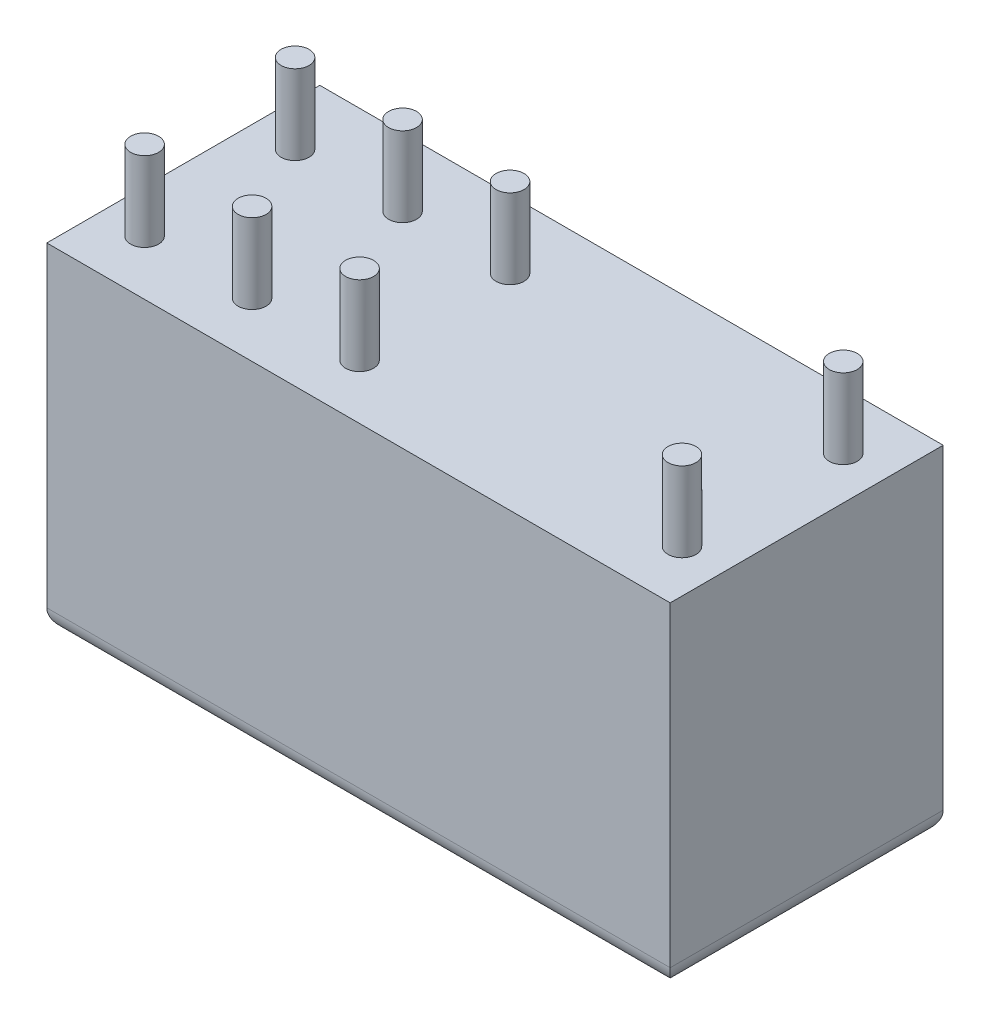
ISO-10303-21;
HEADER;
FILE_DESCRIPTION(('STEP AP214'),'2;1');
FILE_NAME('part.step','',(''),(''),'','','');
FILE_SCHEMA(('AUTOMOTIVE_DESIGN { 1 0 10303 214 1 1 1 1 }'));
ENDSEC;
DATA;
#1=APPLICATION_CONTEXT('core data for automotive mechanical design processes');
#2=APPLICATION_PROTOCOL_DEFINITION('international standard','automotive_design',2000,#1);
#3=PRODUCT_CONTEXT('',#1,'mechanical');
#4=PRODUCT('Part','Part','',(#3));
#5=PRODUCT_RELATED_PRODUCT_CATEGORY('part','',(#4));
#6=PRODUCT_DEFINITION_FORMATION('','',#4);
#7=PRODUCT_DEFINITION_CONTEXT('part definition',#1,'design');
#8=PRODUCT_DEFINITION('design','',#6,#7);
#9=PRODUCT_DEFINITION_SHAPE('','',#8);
#10=(LENGTH_UNIT() NAMED_UNIT(*) SI_UNIT(.MILLI.,.METRE.));
#11=(NAMED_UNIT(*) PLANE_ANGLE_UNIT() SI_UNIT($,.RADIAN.));
#12=(NAMED_UNIT(*) SI_UNIT($,.STERADIAN.) SOLID_ANGLE_UNIT());
#13=UNCERTAINTY_MEASURE_WITH_UNIT(LENGTH_MEASURE(1.E-05),#10,'distance_accuracy_value','');
#14=(GEOMETRIC_REPRESENTATION_CONTEXT(3) GLOBAL_UNCERTAINTY_ASSIGNED_CONTEXT((#13)) GLOBAL_UNIT_ASSIGNED_CONTEXT((#10,
#11,#12)) REPRESENTATION_CONTEXT('',''));
#15=CARTESIAN_POINT('',(0.,0.,0.));
#16=DIRECTION('',(0.,0.,1.));
#17=DIRECTION('',(1.,0.,0.));
#18=AXIS2_PLACEMENT_3D('',#15,#16,#17);
#19=CARTESIAN_POINT('',(0.,15.7,0.));
#20=DIRECTION('',(0.,-1.,0.));
#21=DIRECTION('',(0.,0.,-1.));
#22=AXIS2_PLACEMENT_3D('',#19,#20,#21);
#23=PLANE('',#22);
#24=CARTESIAN_POINT('',(-7.5,15.7,3.8));
#25=DIRECTION('',(0.,-1.,0.));
#26=DIRECTION('',(0.,0.,-1.));
#27=AXIS2_PLACEMENT_3D('',#24,#25,#26);
#28=CIRCLE('',#27,0.649999999999999);
#29=CARTESIAN_POINT('',(-7.5,15.7,3.15));
#30=VERTEX_POINT('',#29);
#31=EDGE_CURVE('E134',#30,#30,#28,.F.);
#32=ORIENTED_EDGE('',*,*,#31,.F.);
#33=EDGE_LOOP('',(#32));
#34=FACE_BOUND('',#33,.T.);
#35=CARTESIAN_POINT('',(12.5,15.7,-3.7));
#36=DIRECTION('',(0.,-1.,0.));
#37=DIRECTION('',(0.,0.,-1.));
#38=AXIS2_PLACEMENT_3D('',#35,#36,#37);
#39=CIRCLE('',#38,0.649999999999999);
#40=CARTESIAN_POINT('',(12.5,15.7,-4.35));
#41=VERTEX_POINT('',#40);
#42=EDGE_CURVE('E128',#41,#41,#39,.F.);
#43=ORIENTED_EDGE('',*,*,#42,.F.);
#44=EDGE_LOOP('',(#43));
#45=FACE_BOUND('',#44,.T.);
#46=CARTESIAN_POINT('',(-7.50000000000002,15.7,-3.2));
#47=DIRECTION('',(0.,-1.,0.));
#48=DIRECTION('',(0.,0.,-1.));
#49=AXIS2_PLACEMENT_3D('',#46,#47,#48);
#50=CIRCLE('',#49,0.649999999999999);
#51=CARTESIAN_POINT('',(-7.50000000000002,15.7,-3.85));
#52=VERTEX_POINT('',#51);
#53=EDGE_CURVE('E122',#52,#52,#50,.F.);
#54=ORIENTED_EDGE('',*,*,#53,.F.);
#55=EDGE_LOOP('',(#54));
#56=FACE_BOUND('',#55,.T.);
#57=CARTESIAN_POINT('',(12.5,15.7,3.8));
#58=DIRECTION('',(0.,-1.,0.));
#59=DIRECTION('',(0.,0.,-1.));
#60=AXIS2_PLACEMENT_3D('',#57,#58,#59);
#61=CIRCLE('',#60,0.649999999999999);
#62=CARTESIAN_POINT('',(12.5,15.7,3.15));
#63=VERTEX_POINT('',#62);
#64=EDGE_CURVE('E111',#63,#63,#61,.F.);
#65=ORIENTED_EDGE('',*,*,#64,.F.);
#66=EDGE_LOOP('',(#65));
#67=FACE_BOUND('',#66,.T.);
#68=DIRECTION('',(0.,0.,-1.));
#69=VECTOR('',#68,1.);
#70=CARTESIAN_POINT('',(14.5,15.7,6.35));
#71=LINE('',#70,#69);
#72=CARTESIAN_POINT('',(14.5,15.7,6.35));
#73=VERTEX_POINT('',#72);
#74=CARTESIAN_POINT('',(14.5,15.7,-6.35));
#75=VERTEX_POINT('',#74);
#76=EDGE_CURVE('E96',#73,#75,#71,.T.);
#77=ORIENTED_EDGE('',*,*,#76,.T.);
#78=DIRECTION('',(-1.,0.,0.));
#79=VECTOR('',#78,1.);
#80=CARTESIAN_POINT('',(-14.5,15.7,-6.35));
#81=LINE('',#80,#79);
#82=CARTESIAN_POINT('',(-14.5,15.7,-6.35));
#83=VERTEX_POINT('',#82);
#84=EDGE_CURVE('E87',#75,#83,#81,.T.);
#85=ORIENTED_EDGE('',*,*,#84,.T.);
#86=DIRECTION('',(0.,0.,1.));
#87=VECTOR('',#86,1.);
#88=CARTESIAN_POINT('',(-14.5,15.7,6.35));
#89=LINE('',#88,#87);
#90=CARTESIAN_POINT('',(-14.5,15.7,6.35));
#91=VERTEX_POINT('',#90);
#92=EDGE_CURVE('E95',#83,#91,#89,.T.);
#93=ORIENTED_EDGE('',*,*,#92,.T.);
#94=DIRECTION('',(1.,0.,0.));
#95=VECTOR('',#94,1.);
#96=CARTESIAN_POINT('',(-14.5,15.7,6.35));
#97=LINE('',#96,#95);
#98=EDGE_CURVE('E101',#91,#73,#97,.T.);
#99=ORIENTED_EDGE('',*,*,#98,.T.);
#100=EDGE_LOOP('',(#77,#85,#93,#99));
#101=FACE_BOUND('',#100,.T.);
#102=CARTESIAN_POINT('',(-12.5,15.7,3.8));
#103=DIRECTION('',(0.,-1.,0.));
#104=DIRECTION('',(0.,0.,-1.));
#105=AXIS2_PLACEMENT_3D('',#102,#103,#104);
#106=CIRCLE('',#105,0.649999999999999);
#107=CARTESIAN_POINT('',(-12.5,15.7,3.15));
#108=VERTEX_POINT('',#107);
#109=EDGE_CURVE('E114',#108,#108,#106,.F.);
#110=ORIENTED_EDGE('',*,*,#109,.F.);
#111=EDGE_LOOP('',(#110));
#112=FACE_BOUND('',#111,.T.);
#113=CARTESIAN_POINT('',(-2.5,15.7,3.8));
#114=DIRECTION('',(0.,-1.,0.));
#115=DIRECTION('',(0.,0.,-1.));
#116=AXIS2_PLACEMENT_3D('',#113,#114,#115);
#117=CIRCLE('',#116,0.649999999999999);
#118=CARTESIAN_POINT('',(-2.5,15.7,3.15));
#119=VERTEX_POINT('',#118);
#120=EDGE_CURVE('E125',#119,#119,#117,.F.);
#121=ORIENTED_EDGE('',*,*,#120,.F.);
#122=EDGE_LOOP('',(#121));
#123=FACE_BOUND('',#122,.T.);
#124=CARTESIAN_POINT('',(-2.50000000000002,15.7,-3.2));
#125=DIRECTION('',(0.,-1.,0.));
#126=DIRECTION('',(0.,0.,-1.));
#127=AXIS2_PLACEMENT_3D('',#124,#125,#126);
#128=CIRCLE('',#127,0.649999999999999);
#129=CARTESIAN_POINT('',(-2.50000000000002,15.7,-3.85));
#130=VERTEX_POINT('',#129);
#131=EDGE_CURVE('E131',#130,#130,#128,.F.);
#132=ORIENTED_EDGE('',*,*,#131,.F.);
#133=EDGE_LOOP('',(#132));
#134=FACE_BOUND('',#133,.T.);
#135=CARTESIAN_POINT('',(-12.5,15.7,-3.2));
#136=DIRECTION('',(0.,-1.,0.));
#137=DIRECTION('',(0.,0.,-1.));
#138=AXIS2_PLACEMENT_3D('',#135,#136,#137);
#139=CIRCLE('',#138,0.649999999999999);
#140=CARTESIAN_POINT('',(-12.5,15.7,-3.85));
#141=VERTEX_POINT('',#140);
#142=EDGE_CURVE('E137',#141,#141,#139,.F.);
#143=ORIENTED_EDGE('',*,*,#142,.F.);
#144=EDGE_LOOP('',(#143));
#145=FACE_BOUND('',#144,.T.);
#146=ADVANCED_FACE('F34',(#34,#45,#56,#67,#101,#112,#123,#134,#145),#23,.F.);
#147=CARTESIAN_POINT('',(14.5,15.7,6.35));
#148=DIRECTION('',(-1.,0.,0.));
#149=DIRECTION('',(0.,0.,1.));
#150=AXIS2_PLACEMENT_3D('',#147,#148,#149);
#151=PLANE('',#150);
#152=DIRECTION('',(0.,-1.,0.));
#153=VECTOR('',#152,1.);
#154=CARTESIAN_POINT('',(14.5,15.7,6.35));
#155=LINE('',#154,#153);
#156=CARTESIAN_POINT('',(14.5,1.,6.35));
#157=VERTEX_POINT('',#156);
#158=EDGE_CURVE('E193',#73,#157,#155,.T.);
#159=ORIENTED_EDGE('',*,*,#158,.T.);
#160=DIRECTION('',(0.,0.,-1.));
#161=VECTOR('',#160,1.);
#162=CARTESIAN_POINT('',(14.5,1.,-6.35));
#163=LINE('',#162,#161);
#164=CARTESIAN_POINT('',(14.5,1.,-6.35));
#165=VERTEX_POINT('',#164);
#166=EDGE_CURVE('E110',#157,#165,#163,.T.);
#167=ORIENTED_EDGE('',*,*,#166,.T.);
#168=DIRECTION('',(0.,-1.,0.));
#169=VECTOR('',#168,1.);
#170=CARTESIAN_POINT('',(14.5,15.7,-6.35));
#171=LINE('',#170,#169);
#172=EDGE_CURVE('E91',#75,#165,#171,.T.);
#173=ORIENTED_EDGE('',*,*,#172,.F.);
#174=ORIENTED_EDGE('',*,*,#76,.F.);
#175=EDGE_LOOP('',(#159,#167,#173,#174));
#176=FACE_BOUND('',#175,.T.);
#177=ADVANCED_FACE('F108',(#176),#151,.F.);
#178=CARTESIAN_POINT('',(-14.5,15.7,-6.35));
#179=DIRECTION('',(0.,0.,1.));
#180=DIRECTION('',(1.,0.,0.));
#181=AXIS2_PLACEMENT_3D('',#178,#179,#180);
#182=PLANE('',#181);
#183=ORIENTED_EDGE('',*,*,#172,.T.);
#184=DIRECTION('',(-1.,0.,0.));
#185=VECTOR('',#184,1.);
#186=CARTESIAN_POINT('',(-14.5,1.,-6.35));
#187=LINE('',#186,#185);
#188=CARTESIAN_POINT('',(-14.5,1.,-6.35));
#189=VERTEX_POINT('',#188);
#190=EDGE_CURVE('E58',#165,#189,#187,.T.);
#191=ORIENTED_EDGE('',*,*,#190,.T.);
#192=DIRECTION('',(0.,-1.,0.));
#193=VECTOR('',#192,1.);
#194=CARTESIAN_POINT('',(-14.5,15.7,-6.35));
#195=LINE('',#194,#193);
#196=EDGE_CURVE('E92',#83,#189,#195,.T.);
#197=ORIENTED_EDGE('',*,*,#196,.F.);
#198=ORIENTED_EDGE('',*,*,#84,.F.);
#199=EDGE_LOOP('',(#183,#191,#197,#198));
#200=FACE_BOUND('',#199,.T.);
#201=ADVANCED_FACE('F89',(#200),#182,.F.);
#202=CARTESIAN_POINT('',(-14.5,15.7,6.35));
#203=DIRECTION('',(1.,0.,0.));
#204=DIRECTION('',(0.,0.,-1.));
#205=AXIS2_PLACEMENT_3D('',#202,#203,#204);
#206=PLANE('',#205);
#207=ORIENTED_EDGE('',*,*,#196,.T.);
#208=DIRECTION('',(0.,0.,1.));
#209=VECTOR('',#208,1.);
#210=CARTESIAN_POINT('',(-14.5,1.,6.35));
#211=LINE('',#210,#209);
#212=CARTESIAN_POINT('',(-14.5,1.,6.35));
#213=VERTEX_POINT('',#212);
#214=EDGE_CURVE('E43',#189,#213,#211,.T.);
#215=ORIENTED_EDGE('',*,*,#214,.T.);
#216=DIRECTION('',(0.,-1.,0.));
#217=VECTOR('',#216,1.);
#218=CARTESIAN_POINT('',(-14.5,15.7,6.35));
#219=LINE('',#218,#217);
#220=EDGE_CURVE('E116',#91,#213,#219,.T.);
#221=ORIENTED_EDGE('',*,*,#220,.F.);
#222=ORIENTED_EDGE('',*,*,#92,.F.);
#223=EDGE_LOOP('',(#207,#215,#221,#222));
#224=FACE_BOUND('',#223,.T.);
#225=ADVANCED_FACE('F231',(#224),#206,.F.);
#226=CARTESIAN_POINT('',(-14.5,15.7,6.35));
#227=DIRECTION('',(0.,0.,-1.));
#228=DIRECTION('',(-1.,0.,0.));
#229=AXIS2_PLACEMENT_3D('',#226,#227,#228);
#230=PLANE('',#229);
#231=ORIENTED_EDGE('',*,*,#220,.T.);
#232=DIRECTION('',(1.,0.,0.));
#233=VECTOR('',#232,1.);
#234=CARTESIAN_POINT('',(14.5,1.,6.35));
#235=LINE('',#234,#233);
#236=EDGE_CURVE('E11',#213,#157,#235,.T.);
#237=ORIENTED_EDGE('',*,*,#236,.T.);
#238=ORIENTED_EDGE('',*,*,#158,.F.);
#239=ORIENTED_EDGE('',*,*,#98,.F.);
#240=EDGE_LOOP('',(#231,#237,#238,#239));
#241=FACE_BOUND('',#240,.T.);
#242=ADVANCED_FACE('F195',(#241),#230,.F.);
#243=CARTESIAN_POINT('',(0.,0.,0.));
#244=DIRECTION('',(0.,-1.,0.));
#245=DIRECTION('',(0.,0.,-1.));
#246=AXIS2_PLACEMENT_3D('',#243,#244,#245);
#247=PLANE('',#246);
#248=DIRECTION('',(-1.,0.,0.));
#249=VECTOR('',#248,1.);
#250=CARTESIAN_POINT('',(14.5,0.,-5.35));
#251=LINE('',#250,#249);
#252=CARTESIAN_POINT('',(-13.5,0.,-5.35));
#253=VERTEX_POINT('',#252);
#254=CARTESIAN_POINT('',(13.5,0.,-5.35));
#255=VERTEX_POINT('',#254);
#256=EDGE_CURVE('E145',#253,#255,#251,.F.);
#257=ORIENTED_EDGE('',*,*,#256,.T.);
#258=DIRECTION('',(0.,0.,-1.));
#259=VECTOR('',#258,1.);
#260=CARTESIAN_POINT('',(13.5,0.,6.35));
#261=LINE('',#260,#259);
#262=CARTESIAN_POINT('',(13.5,0.,5.35));
#263=VERTEX_POINT('',#262);
#264=EDGE_CURVE('E147',#255,#263,#261,.F.);
#265=ORIENTED_EDGE('',*,*,#264,.T.);
#266=DIRECTION('',(1.,0.,0.));
#267=VECTOR('',#266,1.);
#268=CARTESIAN_POINT('',(-14.5,0.,5.35));
#269=LINE('',#268,#267);
#270=CARTESIAN_POINT('',(-13.5,0.,5.35));
#271=VERTEX_POINT('',#270);
#272=EDGE_CURVE('E141',#263,#271,#269,.F.);
#273=ORIENTED_EDGE('',*,*,#272,.T.);
#274=DIRECTION('',(0.,0.,1.));
#275=VECTOR('',#274,1.);
#276=CARTESIAN_POINT('',(-13.5,0.,-6.35));
#277=LINE('',#276,#275);
#278=EDGE_CURVE('E143',#271,#253,#277,.F.);
#279=ORIENTED_EDGE('',*,*,#278,.T.);
#280=EDGE_LOOP('',(#257,#265,#273,#279));
#281=FACE_BOUND('',#280,.T.);
#282=ADVANCED_FACE('F225',(#281),#247,.T.);
#283=CARTESIAN_POINT('',(12.5,19.4,3.8));
#284=DIRECTION('',(0.,-1.,0.));
#285=DIRECTION('',(0.,0.,-1.));
#286=AXIS2_PLACEMENT_3D('',#283,#284,#285);
#287=CYLINDRICAL_SURFACE('',#286,0.649999999999999);
#288=CARTESIAN_POINT('',(12.5,19.4,3.8));
#289=DIRECTION('',(0.,1.,0.));
#290=DIRECTION('',(0.,0.,1.));
#291=AXIS2_PLACEMENT_3D('',#288,#289,#290);
#292=CIRCLE('',#291,0.649999999999999);
#293=CARTESIAN_POINT('',(12.5,19.4,4.45));
#294=VERTEX_POINT('',#293);
#295=EDGE_CURVE('E105',#294,#294,#292,.T.);
#296=ORIENTED_EDGE('',*,*,#295,.F.);
#297=EDGE_LOOP('',(#296));
#298=FACE_BOUND('',#297,.T.);
#299=ORIENTED_EDGE('',*,*,#64,.T.);
#300=EDGE_LOOP('',(#299));
#301=FACE_BOUND('',#300,.T.);
#302=ADVANCED_FACE('F223',(#298,#301),#287,.T.);
#303=CARTESIAN_POINT('',(12.5,19.4,3.8));
#304=DIRECTION('',(0.,1.,0.));
#305=DIRECTION('',(0.,0.,1.));
#306=AXIS2_PLACEMENT_3D('',#303,#304,#305);
#307=PLANE('',#306);
#308=ORIENTED_EDGE('',*,*,#295,.T.);
#309=EDGE_LOOP('',(#308));
#310=FACE_BOUND('',#309,.T.);
#311=ADVANCED_FACE('F258',(#310),#307,.T.);
#312=CARTESIAN_POINT('',(-12.5,19.4,3.8));
#313=DIRECTION('',(0.,-1.,0.));
#314=DIRECTION('',(0.,0.,-1.));
#315=AXIS2_PLACEMENT_3D('',#312,#313,#314);
#316=CYLINDRICAL_SURFACE('',#315,0.649999999999999);
#317=CARTESIAN_POINT('',(-12.5,19.4,3.8));
#318=DIRECTION('',(0.,1.,0.));
#319=DIRECTION('',(0.,0.,1.));
#320=AXIS2_PLACEMENT_3D('',#317,#318,#319);
#321=CIRCLE('',#320,0.649999999999999);
#322=CARTESIAN_POINT('',(-12.5,19.4,4.45));
#323=VERTEX_POINT('',#322);
#324=EDGE_CURVE('E186',#323,#323,#321,.T.);
#325=ORIENTED_EDGE('',*,*,#324,.F.);
#326=EDGE_LOOP('',(#325));
#327=FACE_BOUND('',#326,.T.);
#328=ORIENTED_EDGE('',*,*,#109,.T.);
#329=EDGE_LOOP('',(#328));
#330=FACE_BOUND('',#329,.T.);
#331=ADVANCED_FACE('F265',(#327,#330),#316,.T.);
#332=CARTESIAN_POINT('',(-12.5,19.4,3.8));
#333=DIRECTION('',(0.,1.,0.));
#334=DIRECTION('',(0.,0.,1.));
#335=AXIS2_PLACEMENT_3D('',#332,#333,#334);
#336=PLANE('',#335);
#337=ORIENTED_EDGE('',*,*,#324,.T.);
#338=EDGE_LOOP('',(#337));
#339=FACE_BOUND('',#338,.T.);
#340=ADVANCED_FACE('F272',(#339),#336,.T.);
#341=CARTESIAN_POINT('',(-7.50000000000002,19.4,-3.2));
#342=DIRECTION('',(0.,-1.,0.));
#343=DIRECTION('',(0.,0.,-1.));
#344=AXIS2_PLACEMENT_3D('',#341,#342,#343);
#345=CYLINDRICAL_SURFACE('',#344,0.649999999999999);
#346=CARTESIAN_POINT('',(-7.50000000000002,19.4,-3.2));
#347=DIRECTION('',(0.,1.,0.));
#348=DIRECTION('',(0.,0.,1.));
#349=AXIS2_PLACEMENT_3D('',#346,#347,#348);
#350=CIRCLE('',#349,0.649999999999999);
#351=CARTESIAN_POINT('',(-7.50000000000002,19.4,-2.55));
#352=VERTEX_POINT('',#351);
#353=EDGE_CURVE('E183',#352,#352,#350,.T.);
#354=ORIENTED_EDGE('',*,*,#353,.F.);
#355=EDGE_LOOP('',(#354));
#356=FACE_BOUND('',#355,.T.);
#357=ORIENTED_EDGE('',*,*,#53,.T.);
#358=EDGE_LOOP('',(#357));
#359=FACE_BOUND('',#358,.T.);
#360=ADVANCED_FACE('F280',(#356,#359),#345,.T.);
#361=CARTESIAN_POINT('',(-7.50000000000002,19.4,-3.2));
#362=DIRECTION('',(0.,1.,0.));
#363=DIRECTION('',(0.,0.,1.));
#364=AXIS2_PLACEMENT_3D('',#361,#362,#363);
#365=PLANE('',#364);
#366=ORIENTED_EDGE('',*,*,#353,.T.);
#367=EDGE_LOOP('',(#366));
#368=FACE_BOUND('',#367,.T.);
#369=ADVANCED_FACE('F288',(#368),#365,.T.);
#370=CARTESIAN_POINT('',(-2.5,19.4,3.8));
#371=DIRECTION('',(0.,-1.,0.));
#372=DIRECTION('',(0.,0.,-1.));
#373=AXIS2_PLACEMENT_3D('',#370,#371,#372);
#374=CYLINDRICAL_SURFACE('',#373,0.649999999999999);
#375=CARTESIAN_POINT('',(-2.5,19.4,3.8));
#376=DIRECTION('',(0.,1.,0.));
#377=DIRECTION('',(0.,0.,1.));
#378=AXIS2_PLACEMENT_3D('',#375,#376,#377);
#379=CIRCLE('',#378,0.649999999999999);
#380=CARTESIAN_POINT('',(-2.5,19.4,4.45));
#381=VERTEX_POINT('',#380);
#382=EDGE_CURVE('E180',#381,#381,#379,.T.);
#383=ORIENTED_EDGE('',*,*,#382,.F.);
#384=EDGE_LOOP('',(#383));
#385=FACE_BOUND('',#384,.T.);
#386=ORIENTED_EDGE('',*,*,#120,.T.);
#387=EDGE_LOOP('',(#386));
#388=FACE_BOUND('',#387,.T.);
#389=ADVANCED_FACE('F296',(#385,#388),#374,.T.);
#390=CARTESIAN_POINT('',(-2.5,19.4,3.8));
#391=DIRECTION('',(0.,1.,0.));
#392=DIRECTION('',(0.,0.,1.));
#393=AXIS2_PLACEMENT_3D('',#390,#391,#392);
#394=PLANE('',#393);
#395=ORIENTED_EDGE('',*,*,#382,.T.);
#396=EDGE_LOOP('',(#395));
#397=FACE_BOUND('',#396,.T.);
#398=ADVANCED_FACE('F304',(#397),#394,.T.);
#399=CARTESIAN_POINT('',(12.5,19.4,-3.7));
#400=DIRECTION('',(0.,-1.,0.));
#401=DIRECTION('',(0.,0.,-1.));
#402=AXIS2_PLACEMENT_3D('',#399,#400,#401);
#403=CYLINDRICAL_SURFACE('',#402,0.649999999999999);
#404=CARTESIAN_POINT('',(12.5,19.4,-3.7));
#405=DIRECTION('',(0.,1.,0.));
#406=DIRECTION('',(0.,0.,1.));
#407=AXIS2_PLACEMENT_3D('',#404,#405,#406);
#408=CIRCLE('',#407,0.649999999999999);
#409=CARTESIAN_POINT('',(12.5,19.4,-3.05));
#410=VERTEX_POINT('',#409);
#411=EDGE_CURVE('E177',#410,#410,#408,.T.);
#412=ORIENTED_EDGE('',*,*,#411,.F.);
#413=EDGE_LOOP('',(#412));
#414=FACE_BOUND('',#413,.T.);
#415=ORIENTED_EDGE('',*,*,#42,.T.);
#416=EDGE_LOOP('',(#415));
#417=FACE_BOUND('',#416,.T.);
#418=ADVANCED_FACE('F312',(#414,#417),#403,.T.);
#419=CARTESIAN_POINT('',(12.5,19.4,-3.7));
#420=DIRECTION('',(0.,1.,0.));
#421=DIRECTION('',(0.,0.,1.));
#422=AXIS2_PLACEMENT_3D('',#419,#420,#421);
#423=PLANE('',#422);
#424=ORIENTED_EDGE('',*,*,#411,.T.);
#425=EDGE_LOOP('',(#424));
#426=FACE_BOUND('',#425,.T.);
#427=ADVANCED_FACE('F320',(#426),#423,.T.);
#428=CARTESIAN_POINT('',(-2.50000000000002,19.4,-3.2));
#429=DIRECTION('',(0.,-1.,0.));
#430=DIRECTION('',(0.,0.,-1.));
#431=AXIS2_PLACEMENT_3D('',#428,#429,#430);
#432=CYLINDRICAL_SURFACE('',#431,0.649999999999999);
#433=CARTESIAN_POINT('',(-2.50000000000002,19.4,-3.2));
#434=DIRECTION('',(0.,1.,0.));
#435=DIRECTION('',(0.,0.,1.));
#436=AXIS2_PLACEMENT_3D('',#433,#434,#435);
#437=CIRCLE('',#436,0.649999999999999);
#438=CARTESIAN_POINT('',(-2.50000000000002,19.4,-2.55));
#439=VERTEX_POINT('',#438);
#440=EDGE_CURVE('E172',#439,#439,#437,.T.);
#441=ORIENTED_EDGE('',*,*,#440,.F.);
#442=EDGE_LOOP('',(#441));
#443=FACE_BOUND('',#442,.T.);
#444=ORIENTED_EDGE('',*,*,#131,.T.);
#445=EDGE_LOOP('',(#444));
#446=FACE_BOUND('',#445,.T.);
#447=ADVANCED_FACE('F328',(#443,#446),#432,.T.);
#448=CARTESIAN_POINT('',(-2.50000000000002,19.4,-3.2));
#449=DIRECTION('',(0.,1.,0.));
#450=DIRECTION('',(0.,0.,1.));
#451=AXIS2_PLACEMENT_3D('',#448,#449,#450);
#452=PLANE('',#451);
#453=ORIENTED_EDGE('',*,*,#440,.T.);
#454=EDGE_LOOP('',(#453));
#455=FACE_BOUND('',#454,.T.);
#456=ADVANCED_FACE('F336',(#455),#452,.T.);
#457=CARTESIAN_POINT('',(-7.5,19.4,3.8));
#458=DIRECTION('',(0.,-1.,0.));
#459=DIRECTION('',(0.,0.,-1.));
#460=AXIS2_PLACEMENT_3D('',#457,#458,#459);
#461=CYLINDRICAL_SURFACE('',#460,0.649999999999999);
#462=CARTESIAN_POINT('',(-7.5,19.4,3.8));
#463=DIRECTION('',(0.,1.,0.));
#464=DIRECTION('',(0.,0.,1.));
#465=AXIS2_PLACEMENT_3D('',#462,#463,#464);
#466=CIRCLE('',#465,0.649999999999999);
#467=CARTESIAN_POINT('',(-7.5,19.4,4.45));
#468=VERTEX_POINT('',#467);
#469=EDGE_CURVE('E167',#468,#468,#466,.T.);
#470=ORIENTED_EDGE('',*,*,#469,.F.);
#471=EDGE_LOOP('',(#470));
#472=FACE_BOUND('',#471,.T.);
#473=ORIENTED_EDGE('',*,*,#31,.T.);
#474=EDGE_LOOP('',(#473));
#475=FACE_BOUND('',#474,.T.);
#476=ADVANCED_FACE('F344',(#472,#475),#461,.T.);
#477=CARTESIAN_POINT('',(-7.5,19.4,3.8));
#478=DIRECTION('',(0.,1.,0.));
#479=DIRECTION('',(0.,0.,1.));
#480=AXIS2_PLACEMENT_3D('',#477,#478,#479);
#481=PLANE('',#480);
#482=ORIENTED_EDGE('',*,*,#469,.T.);
#483=EDGE_LOOP('',(#482));
#484=FACE_BOUND('',#483,.T.);
#485=ADVANCED_FACE('F352',(#484),#481,.T.);
#486=CARTESIAN_POINT('',(-12.5,19.4,-3.2));
#487=DIRECTION('',(0.,-1.,0.));
#488=DIRECTION('',(0.,0.,-1.));
#489=AXIS2_PLACEMENT_3D('',#486,#487,#488);
#490=CYLINDRICAL_SURFACE('',#489,0.649999999999999);
#491=CARTESIAN_POINT('',(-12.5,19.4,-3.2));
#492=DIRECTION('',(0.,1.,0.));
#493=DIRECTION('',(0.,0.,1.));
#494=AXIS2_PLACEMENT_3D('',#491,#492,#493);
#495=CIRCLE('',#494,0.649999999999999);
#496=CARTESIAN_POINT('',(-12.5,19.4,-2.55));
#497=VERTEX_POINT('',#496);
#498=EDGE_CURVE('E161',#497,#497,#495,.T.);
#499=ORIENTED_EDGE('',*,*,#498,.F.);
#500=EDGE_LOOP('',(#499));
#501=FACE_BOUND('',#500,.T.);
#502=ORIENTED_EDGE('',*,*,#142,.T.);
#503=EDGE_LOOP('',(#502));
#504=FACE_BOUND('',#503,.T.);
#505=ADVANCED_FACE('F360',(#501,#504),#490,.T.);
#506=CARTESIAN_POINT('',(-12.5,19.4,-3.2));
#507=DIRECTION('',(0.,1.,0.));
#508=DIRECTION('',(0.,0.,1.));
#509=AXIS2_PLACEMENT_3D('',#506,#507,#508);
#510=PLANE('',#509);
#511=ORIENTED_EDGE('',*,*,#498,.T.);
#512=EDGE_LOOP('',(#511));
#513=FACE_BOUND('',#512,.T.);
#514=ADVANCED_FACE('F368',(#513),#510,.T.);
#515=CARTESIAN_POINT('',(-13.5,1.,6.35));
#516=DIRECTION('',(0.,0.,-1.));
#517=DIRECTION('',(-1.,0.,0.));
#518=AXIS2_PLACEMENT_3D('',#515,#516,#517);
#519=CYLINDRICAL_SURFACE('',#518,1.);
#520=CARTESIAN_POINT('',(-13.5,1.,-5.35));
#521=DIRECTION('',(0.707106781186547,0.,-0.707106781186547));
#522=DIRECTION('',(-0.707106781186547,0.,-0.707106781186547));
#523=AXIS2_PLACEMENT_3D('',#520,#521,#522);
#524=ELLIPSE('',#523,1.41421356237309,1.);
#525=EDGE_CURVE('E155',#253,#189,#524,.T.);
#526=ORIENTED_EDGE('',*,*,#525,.F.);
#527=ORIENTED_EDGE('',*,*,#278,.F.);
#528=CARTESIAN_POINT('',(-13.5,1.,5.35));
#529=DIRECTION('',(-0.707106781186547,0.,-0.707106781186547));
#530=DIRECTION('',(-0.707106781186547,0.,0.707106781186547));
#531=AXIS2_PLACEMENT_3D('',#528,#529,#530);
#532=ELLIPSE('',#531,1.41421356237309,1.);
#533=EDGE_CURVE('E38',#213,#271,#532,.F.);
#534=ORIENTED_EDGE('',*,*,#533,.F.);
#535=ORIENTED_EDGE('',*,*,#214,.F.);
#536=EDGE_LOOP('',(#526,#527,#534,#535));
#537=FACE_BOUND('',#536,.T.);
#538=ADVANCED_FACE('F36',(#537),#519,.T.);
#539=CARTESIAN_POINT('',(-14.5,1.,5.35));
#540=DIRECTION('',(-1.,0.,0.));
#541=DIRECTION('',(0.,0.,1.));
#542=AXIS2_PLACEMENT_3D('',#539,#540,#541);
#543=CYLINDRICAL_SURFACE('',#542,1.);
#544=ORIENTED_EDGE('',*,*,#533,.T.);
#545=ORIENTED_EDGE('',*,*,#272,.F.);
#546=CARTESIAN_POINT('',(13.5,1.,5.35));
#547=DIRECTION('',(-0.707106781186547,0.,0.707106781186547));
#548=DIRECTION('',(-0.707106781186547,0.,-0.707106781186547));
#549=AXIS2_PLACEMENT_3D('',#546,#547,#548);
#550=ELLIPSE('',#549,1.41421356237309,1.);
#551=EDGE_CURVE('E154',#157,#263,#550,.F.);
#552=ORIENTED_EDGE('',*,*,#551,.F.);
#553=ORIENTED_EDGE('',*,*,#236,.F.);
#554=EDGE_LOOP('',(#544,#545,#552,#553));
#555=FACE_BOUND('',#554,.T.);
#556=ADVANCED_FACE('F199',(#555),#543,.T.);
#557=CARTESIAN_POINT('',(-14.5,1.,-5.35));
#558=DIRECTION('',(1.,0.,0.));
#559=DIRECTION('',(0.,0.,-1.));
#560=AXIS2_PLACEMENT_3D('',#557,#558,#559);
#561=CYLINDRICAL_SURFACE('',#560,1.);
#562=ORIENTED_EDGE('',*,*,#525,.T.);
#563=ORIENTED_EDGE('',*,*,#190,.F.);
#564=CARTESIAN_POINT('',(13.5,1.,-5.35));
#565=DIRECTION('',(0.707106781186547,0.,0.707106781186547));
#566=DIRECTION('',(0.707106781186547,0.,-0.707106781186547));
#567=AXIS2_PLACEMENT_3D('',#564,#565,#566);
#568=ELLIPSE('',#567,1.41421356237309,1.);
#569=EDGE_CURVE('E152',#255,#165,#568,.T.);
#570=ORIENTED_EDGE('',*,*,#569,.F.);
#571=ORIENTED_EDGE('',*,*,#256,.F.);
#572=EDGE_LOOP('',(#562,#563,#570,#571));
#573=FACE_BOUND('',#572,.T.);
#574=ADVANCED_FACE('F204',(#573),#561,.T.);
#575=CARTESIAN_POINT('',(13.5,1.,6.35));
#576=DIRECTION('',(0.,0.,1.));
#577=DIRECTION('',(1.,0.,0.));
#578=AXIS2_PLACEMENT_3D('',#575,#576,#577);
#579=CYLINDRICAL_SURFACE('',#578,1.);
#580=ORIENTED_EDGE('',*,*,#551,.T.);
#581=ORIENTED_EDGE('',*,*,#264,.F.);
#582=ORIENTED_EDGE('',*,*,#569,.T.);
#583=ORIENTED_EDGE('',*,*,#166,.F.);
#584=EDGE_LOOP('',(#580,#581,#582,#583));
#585=FACE_BOUND('',#584,.T.);
#586=ADVANCED_FACE('F202',(#585),#579,.T.);
#587=CLOSED_SHELL('',(#146,#177,#201,#225,#242,#282,#302,#311,#331,#340,#360,#369,#389,#398,
#418,#427,#447,#456,#476,#485,#505,#514,#538,#556,#574,#586));
#588=MANIFOLD_SOLID_BREP('B2',#587);
#589=ADVANCED_BREP_SHAPE_REPRESENTATION('',(#18,#588),#14);
#590=SHAPE_DEFINITION_REPRESENTATION(#9,#589);
ENDSEC;
END-ISO-10303-21;
